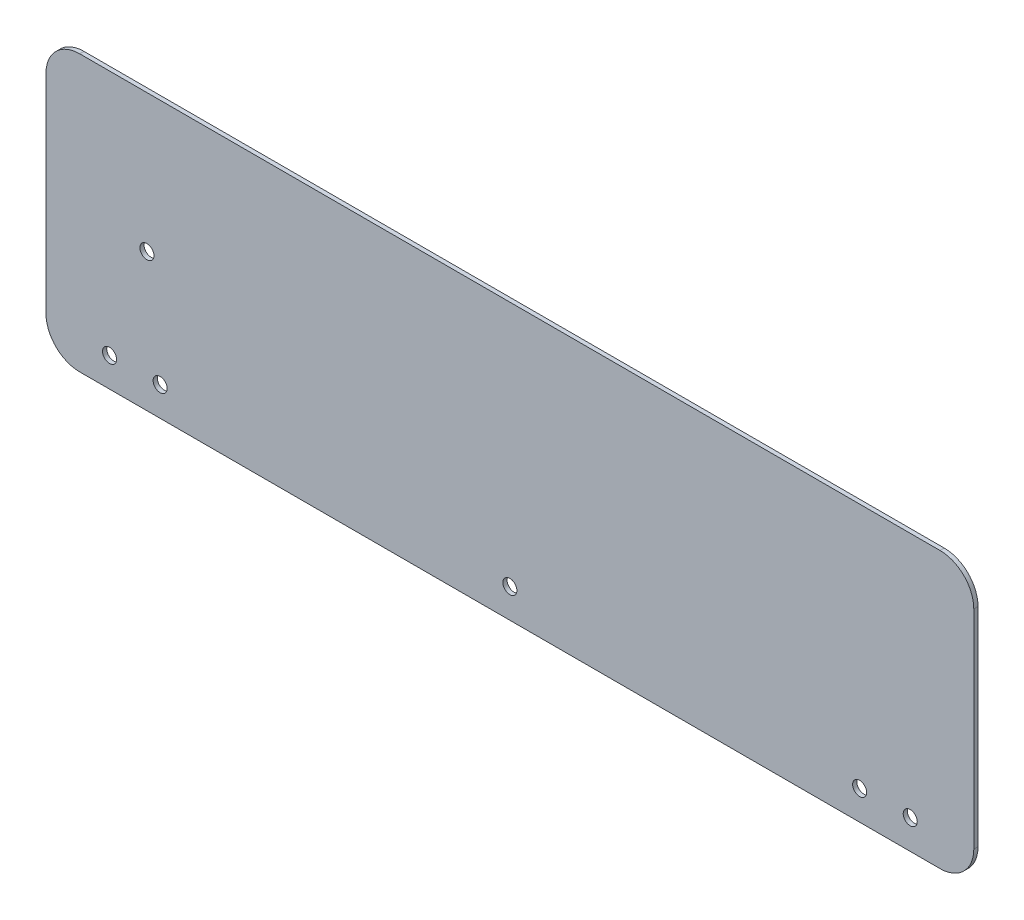
ISO-10303-21;
HEADER;
FILE_DESCRIPTION(('STEP AP214'),'2;1');
FILE_NAME('part.step','',(''),(''),'','','');
FILE_SCHEMA(('AUTOMOTIVE_DESIGN { 1 0 10303 214 1 1 1 1 }'));
ENDSEC;
DATA;
#1=APPLICATION_CONTEXT('core data for automotive mechanical design processes');
#2=APPLICATION_PROTOCOL_DEFINITION('international standard','automotive_design',2000,#1);
#3=PRODUCT_CONTEXT('',#1,'mechanical');
#4=PRODUCT('Part','Part','',(#3));
#5=PRODUCT_RELATED_PRODUCT_CATEGORY('part','',(#4));
#6=PRODUCT_DEFINITION_FORMATION('','',#4);
#7=PRODUCT_DEFINITION_CONTEXT('part definition',#1,'design');
#8=PRODUCT_DEFINITION('design','',#6,#7);
#9=PRODUCT_DEFINITION_SHAPE('','',#8);
#10=(LENGTH_UNIT() NAMED_UNIT(*) SI_UNIT(.MILLI.,.METRE.));
#11=(NAMED_UNIT(*) PLANE_ANGLE_UNIT() SI_UNIT($,.RADIAN.));
#12=(NAMED_UNIT(*) SI_UNIT($,.STERADIAN.) SOLID_ANGLE_UNIT());
#13=UNCERTAINTY_MEASURE_WITH_UNIT(LENGTH_MEASURE(1.E-05),#10,'distance_accuracy_value','');
#14=(GEOMETRIC_REPRESENTATION_CONTEXT(3) GLOBAL_UNCERTAINTY_ASSIGNED_CONTEXT((#13)) GLOBAL_UNIT_ASSIGNED_CONTEXT((#10,
#11,#12)) REPRESENTATION_CONTEXT('',''));
#15=CARTESIAN_POINT('',(0.,0.,0.));
#16=DIRECTION('',(0.,0.,1.));
#17=DIRECTION('',(1.,0.,0.));
#18=AXIS2_PLACEMENT_3D('',#15,#16,#17);
#19=CARTESIAN_POINT('',(19.431,4.699,-0.1905));
#20=DIRECTION('',(0.,0.,1.));
#21=DIRECTION('',(1.,0.,0.));
#22=AXIS2_PLACEMENT_3D('',#19,#20,#21);
#23=CYLINDRICAL_SURFACE('',#22,1.524);
#24=CARTESIAN_POINT('',(19.431,4.699,0.));
#25=DIRECTION('',(0.,0.,1.));
#26=DIRECTION('',(1.,0.,0.));
#27=AXIS2_PLACEMENT_3D('',#24,#25,#26);
#28=CIRCLE('',#27,1.524);
#29=CARTESIAN_POINT('',(20.955,4.699,0.));
#30=VERTEX_POINT('',#29);
#31=CARTESIAN_POINT('',(19.431,6.223,0.));
#32=VERTEX_POINT('',#31);
#33=EDGE_CURVE('E135',#30,#32,#28,.T.);
#34=ORIENTED_EDGE('',*,*,#33,.F.);
#35=DIRECTION('',(0.,0.,1.));
#36=VECTOR('',#35,1.);
#37=CARTESIAN_POINT('',(20.955,4.699,-0.1905));
#38=LINE('',#37,#36);
#39=CARTESIAN_POINT('',(20.955,4.699,-0.1905));
#40=VERTEX_POINT('',#39);
#41=EDGE_CURVE('E11',#40,#30,#38,.T.);
#42=ORIENTED_EDGE('',*,*,#41,.F.);
#43=CARTESIAN_POINT('',(19.431,4.699,-0.1905));
#44=DIRECTION('',(0.,0.,1.));
#45=DIRECTION('',(1.,0.,0.));
#46=AXIS2_PLACEMENT_3D('',#43,#44,#45);
#47=CIRCLE('',#46,1.524);
#48=CARTESIAN_POINT('',(19.431,6.223,-0.1905));
#49=VERTEX_POINT('',#48);
#50=EDGE_CURVE('E156',#40,#49,#47,.T.);
#51=ORIENTED_EDGE('',*,*,#50,.T.);
#52=DIRECTION('',(0.,0.,1.));
#53=VECTOR('',#52,1.);
#54=CARTESIAN_POINT('',(19.431,6.223,-0.1905));
#55=LINE('',#54,#53);
#56=EDGE_CURVE('E41',#49,#32,#55,.T.);
#57=ORIENTED_EDGE('',*,*,#56,.T.);
#58=EDGE_LOOP('',(#34,#42,#51,#57));
#59=FACE_BOUND('',#58,.T.);
#60=ADVANCED_FACE('F38',(#59),#23,.T.);
#61=CARTESIAN_POINT('',(20.955,-4.699,-0.1905));
#62=DIRECTION('',(1.,0.,0.));
#63=DIRECTION('',(0.,0.,-1.));
#64=AXIS2_PLACEMENT_3D('',#61,#62,#63);
#65=PLANE('',#64);
#66=DIRECTION('',(0.,1.,0.));
#67=VECTOR('',#66,1.);
#68=CARTESIAN_POINT('',(20.955,-4.699,0.));
#69=LINE('',#68,#67);
#70=CARTESIAN_POINT('',(20.955,-4.699,0.));
#71=VERTEX_POINT('',#70);
#72=EDGE_CURVE('E154',#71,#30,#69,.T.);
#73=ORIENTED_EDGE('',*,*,#72,.F.);
#74=DIRECTION('',(0.,0.,1.));
#75=VECTOR('',#74,1.);
#76=CARTESIAN_POINT('',(20.955,-4.699,-0.1905));
#77=LINE('',#76,#75);
#78=CARTESIAN_POINT('',(20.955,-4.699,-0.1905));
#79=VERTEX_POINT('',#78);
#80=EDGE_CURVE('E47',#79,#71,#77,.T.);
#81=ORIENTED_EDGE('',*,*,#80,.F.);
#82=DIRECTION('',(0.,1.,0.));
#83=VECTOR('',#82,1.);
#84=CARTESIAN_POINT('',(20.955,-4.699,-0.1905));
#85=LINE('',#84,#83);
#86=EDGE_CURVE('E125',#79,#40,#85,.T.);
#87=ORIENTED_EDGE('',*,*,#86,.T.);
#88=ORIENTED_EDGE('',*,*,#41,.T.);
#89=EDGE_LOOP('',(#73,#81,#87,#88));
#90=FACE_BOUND('',#89,.T.);
#91=ADVANCED_FACE('F168',(#90),#65,.T.);
#92=CARTESIAN_POINT('',(19.431,-4.699,-0.1905));
#93=DIRECTION('',(0.,0.,1.));
#94=DIRECTION('',(1.,0.,0.));
#95=AXIS2_PLACEMENT_3D('',#92,#93,#94);
#96=CYLINDRICAL_SURFACE('',#95,1.524);
#97=CARTESIAN_POINT('',(19.431,-4.699,0.));
#98=DIRECTION('',(0.,0.,1.));
#99=DIRECTION('',(1.,0.,0.));
#100=AXIS2_PLACEMENT_3D('',#97,#98,#99);
#101=CIRCLE('',#100,1.524);
#102=CARTESIAN_POINT('',(19.431,-6.223,0.));
#103=VERTEX_POINT('',#102);
#104=EDGE_CURVE('E112',#103,#71,#101,.T.);
#105=ORIENTED_EDGE('',*,*,#104,.F.);
#106=DIRECTION('',(0.,0.,1.));
#107=VECTOR('',#106,1.);
#108=CARTESIAN_POINT('',(19.431,-6.223,-0.1905));
#109=LINE('',#108,#107);
#110=CARTESIAN_POINT('',(19.431,-6.223,-0.1905));
#111=VERTEX_POINT('',#110);
#112=EDGE_CURVE('E107',#111,#103,#109,.T.);
#113=ORIENTED_EDGE('',*,*,#112,.F.);
#114=CARTESIAN_POINT('',(19.431,-4.699,-0.1905));
#115=DIRECTION('',(0.,0.,1.));
#116=DIRECTION('',(1.,0.,0.));
#117=AXIS2_PLACEMENT_3D('',#114,#115,#116);
#118=CIRCLE('',#117,1.524);
#119=EDGE_CURVE('E110',#111,#79,#118,.T.);
#120=ORIENTED_EDGE('',*,*,#119,.T.);
#121=ORIENTED_EDGE('',*,*,#80,.T.);
#122=EDGE_LOOP('',(#105,#113,#120,#121));
#123=FACE_BOUND('',#122,.T.);
#124=ADVANCED_FACE('F109',(#123),#96,.T.);
#125=CARTESIAN_POINT('',(-19.431,-6.223,-0.1905));
#126=DIRECTION('',(0.,-1.,0.));
#127=DIRECTION('',(0.,0.,-1.));
#128=AXIS2_PLACEMENT_3D('',#125,#126,#127);
#129=PLANE('',#128);
#130=DIRECTION('',(1.,0.,0.));
#131=VECTOR('',#130,1.);
#132=CARTESIAN_POINT('',(-19.431,-6.223,0.));
#133=LINE('',#132,#131);
#134=CARTESIAN_POINT('',(-19.431,-6.223,0.));
#135=VERTEX_POINT('',#134);
#136=EDGE_CURVE('E151',#135,#103,#133,.T.);
#137=ORIENTED_EDGE('',*,*,#136,.F.);
#138=DIRECTION('',(0.,0.,1.));
#139=VECTOR('',#138,1.);
#140=CARTESIAN_POINT('',(-19.431,-6.223,-0.1905));
#141=LINE('',#140,#139);
#142=CARTESIAN_POINT('',(-19.431,-6.223,-0.1905));
#143=VERTEX_POINT('',#142);
#144=EDGE_CURVE('E117',#143,#135,#141,.T.);
#145=ORIENTED_EDGE('',*,*,#144,.F.);
#146=DIRECTION('',(1.,0.,0.));
#147=VECTOR('',#146,1.);
#148=CARTESIAN_POINT('',(-19.431,-6.223,-0.1905));
#149=LINE('',#148,#147);
#150=EDGE_CURVE('E123',#143,#111,#149,.T.);
#151=ORIENTED_EDGE('',*,*,#150,.T.);
#152=ORIENTED_EDGE('',*,*,#112,.T.);
#153=EDGE_LOOP('',(#137,#145,#151,#152));
#154=FACE_BOUND('',#153,.T.);
#155=ADVANCED_FACE('F127',(#154),#129,.T.);
#156=CARTESIAN_POINT('',(-19.431,-4.699,-0.1905));
#157=DIRECTION('',(0.,0.,1.));
#158=DIRECTION('',(1.,0.,0.));
#159=AXIS2_PLACEMENT_3D('',#156,#157,#158);
#160=CYLINDRICAL_SURFACE('',#159,1.524);
#161=CARTESIAN_POINT('',(-19.431,-4.699,0.));
#162=DIRECTION('',(0.,0.,1.));
#163=DIRECTION('',(1.,0.,0.));
#164=AXIS2_PLACEMENT_3D('',#161,#162,#163);
#165=CIRCLE('',#164,1.524);
#166=CARTESIAN_POINT('',(-20.955,-4.699,0.));
#167=VERTEX_POINT('',#166);
#168=EDGE_CURVE('E148',#167,#135,#165,.T.);
#169=ORIENTED_EDGE('',*,*,#168,.F.);
#170=DIRECTION('',(0.,0.,1.));
#171=VECTOR('',#170,1.);
#172=CARTESIAN_POINT('',(-20.955,-4.699,-0.1905));
#173=LINE('',#172,#171);
#174=CARTESIAN_POINT('',(-20.955,-4.699,-0.1905));
#175=VERTEX_POINT('',#174);
#176=EDGE_CURVE('E160',#175,#167,#173,.T.);
#177=ORIENTED_EDGE('',*,*,#176,.F.);
#178=CARTESIAN_POINT('',(-19.431,-4.699,-0.1905));
#179=DIRECTION('',(0.,0.,1.));
#180=DIRECTION('',(1.,0.,0.));
#181=AXIS2_PLACEMENT_3D('',#178,#179,#180);
#182=CIRCLE('',#181,1.524);
#183=EDGE_CURVE('E128',#175,#143,#182,.T.);
#184=ORIENTED_EDGE('',*,*,#183,.T.);
#185=ORIENTED_EDGE('',*,*,#144,.T.);
#186=EDGE_LOOP('',(#169,#177,#184,#185));
#187=FACE_BOUND('',#186,.T.);
#188=ADVANCED_FACE('F181',(#187),#160,.T.);
#189=CARTESIAN_POINT('',(-20.955,4.699,-0.1905));
#190=DIRECTION('',(-1.,0.,0.));
#191=DIRECTION('',(0.,0.,1.));
#192=AXIS2_PLACEMENT_3D('',#189,#190,#191);
#193=PLANE('',#192);
#194=DIRECTION('',(0.,-1.,0.));
#195=VECTOR('',#194,1.);
#196=CARTESIAN_POINT('',(-20.955,4.699,0.));
#197=LINE('',#196,#195);
#198=CARTESIAN_POINT('',(-20.955,4.699,0.));
#199=VERTEX_POINT('',#198);
#200=EDGE_CURVE('E145',#199,#167,#197,.T.);
#201=ORIENTED_EDGE('',*,*,#200,.F.);
#202=DIRECTION('',(0.,0.,1.));
#203=VECTOR('',#202,1.);
#204=CARTESIAN_POINT('',(-20.955,4.699,-0.1905));
#205=LINE('',#204,#203);
#206=CARTESIAN_POINT('',(-20.955,4.699,-0.1905));
#207=VERTEX_POINT('',#206);
#208=EDGE_CURVE('E162',#207,#199,#205,.T.);
#209=ORIENTED_EDGE('',*,*,#208,.F.);
#210=DIRECTION('',(0.,-1.,0.));
#211=VECTOR('',#210,1.);
#212=CARTESIAN_POINT('',(-20.955,4.699,-0.1905));
#213=LINE('',#212,#211);
#214=EDGE_CURVE('E130',#207,#175,#213,.T.);
#215=ORIENTED_EDGE('',*,*,#214,.T.);
#216=ORIENTED_EDGE('',*,*,#176,.T.);
#217=EDGE_LOOP('',(#201,#209,#215,#216));
#218=FACE_BOUND('',#217,.T.);
#219=ADVANCED_FACE('F184',(#218),#193,.T.);
#220=CARTESIAN_POINT('',(-19.431,4.699,-0.1905));
#221=DIRECTION('',(0.,0.,1.));
#222=DIRECTION('',(1.,0.,0.));
#223=AXIS2_PLACEMENT_3D('',#220,#221,#222);
#224=CYLINDRICAL_SURFACE('',#223,1.524);
#225=CARTESIAN_POINT('',(-19.431,4.699,0.));
#226=DIRECTION('',(0.,0.,1.));
#227=DIRECTION('',(1.,0.,0.));
#228=AXIS2_PLACEMENT_3D('',#225,#226,#227);
#229=CIRCLE('',#228,1.524);
#230=CARTESIAN_POINT('',(-19.431,6.223,0.));
#231=VERTEX_POINT('',#230);
#232=EDGE_CURVE('E142',#231,#199,#229,.T.);
#233=ORIENTED_EDGE('',*,*,#232,.F.);
#234=DIRECTION('',(0.,0.,1.));
#235=VECTOR('',#234,1.);
#236=CARTESIAN_POINT('',(-19.431,6.223,-0.1905));
#237=LINE('',#236,#235);
#238=CARTESIAN_POINT('',(-19.431,6.223,-0.1905));
#239=VERTEX_POINT('',#238);
#240=EDGE_CURVE('E163',#239,#231,#237,.T.);
#241=ORIENTED_EDGE('',*,*,#240,.F.);
#242=CARTESIAN_POINT('',(-19.431,4.699,-0.1905));
#243=DIRECTION('',(0.,0.,1.));
#244=DIRECTION('',(1.,0.,0.));
#245=AXIS2_PLACEMENT_3D('',#242,#243,#244);
#246=CIRCLE('',#245,1.524);
#247=EDGE_CURVE('E270',#239,#207,#246,.T.);
#248=ORIENTED_EDGE('',*,*,#247,.T.);
#249=ORIENTED_EDGE('',*,*,#208,.T.);
#250=EDGE_LOOP('',(#233,#241,#248,#249));
#251=FACE_BOUND('',#250,.T.);
#252=ADVANCED_FACE('F188',(#251),#224,.T.);
#253=CARTESIAN_POINT('',(19.431,6.223,-0.1905));
#254=DIRECTION('',(0.,1.,0.));
#255=DIRECTION('',(0.,0.,1.));
#256=AXIS2_PLACEMENT_3D('',#253,#254,#255);
#257=PLANE('',#256);
#258=DIRECTION('',(-1.,0.,0.));
#259=VECTOR('',#258,1.);
#260=CARTESIAN_POINT('',(19.431,6.223,0.));
#261=LINE('',#260,#259);
#262=EDGE_CURVE('E138',#32,#231,#261,.T.);
#263=ORIENTED_EDGE('',*,*,#262,.F.);
#264=ORIENTED_EDGE('',*,*,#56,.F.);
#265=DIRECTION('',(-1.,0.,0.));
#266=VECTOR('',#265,1.);
#267=CARTESIAN_POINT('',(19.431,6.223,-0.1905));
#268=LINE('',#267,#266);
#269=EDGE_CURVE('E268',#49,#239,#268,.T.);
#270=ORIENTED_EDGE('',*,*,#269,.T.);
#271=ORIENTED_EDGE('',*,*,#240,.T.);
#272=EDGE_LOOP('',(#263,#264,#270,#271));
#273=FACE_BOUND('',#272,.T.);
#274=ADVANCED_FACE('F165',(#273),#257,.T.);
#275=CARTESIAN_POINT('',(19.431,4.699,-0.1905));
#276=DIRECTION('',(0.,0.,1.));
#277=DIRECTION('',(1.,0.,0.));
#278=AXIS2_PLACEMENT_3D('',#275,#276,#277);
#279=PLANE('',#278);
#280=CARTESIAN_POINT('',(-18.0848,-4.9022,-0.1905));
#281=DIRECTION('',(0.,0.,1.));
#282=DIRECTION('',(1.,0.,0.));
#283=AXIS2_PLACEMENT_3D('',#280,#281,#282);
#284=CIRCLE('',#283,0.3175);
#285=CARTESIAN_POINT('',(-17.7673,-4.9022,-0.1905));
#286=VERTEX_POINT('',#285);
#287=EDGE_CURVE('E231',#286,#286,#284,.T.);
#288=ORIENTED_EDGE('',*,*,#287,.T.);
#289=EDGE_LOOP('',(#288));
#290=FACE_BOUND('',#289,.T.);
#291=CARTESIAN_POINT('',(-15.7988,-4.9022,-0.1905));
#292=DIRECTION('',(0.,0.,1.));
#293=DIRECTION('',(1.,0.,0.));
#294=AXIS2_PLACEMENT_3D('',#291,#292,#293);
#295=CIRCLE('',#294,0.317500000000004);
#296=CARTESIAN_POINT('',(-15.4813,-4.9022,-0.1905));
#297=VERTEX_POINT('',#296);
#298=EDGE_CURVE('E239',#297,#297,#295,.T.);
#299=ORIENTED_EDGE('',*,*,#298,.T.);
#300=EDGE_LOOP('',(#299));
#301=FACE_BOUND('',#300,.T.);
#302=CARTESIAN_POINT('',(-16.3957,0.,-0.1905));
#303=DIRECTION('',(0.,0.,1.));
#304=DIRECTION('',(1.,0.,0.));
#305=AXIS2_PLACEMENT_3D('',#302,#303,#304);
#306=CIRCLE('',#305,0.317499999999997);
#307=CARTESIAN_POINT('',(-16.0782,0.,-0.1905));
#308=VERTEX_POINT('',#307);
#309=EDGE_CURVE('E245',#308,#308,#306,.T.);
#310=ORIENTED_EDGE('',*,*,#309,.T.);
#311=EDGE_LOOP('',(#310));
#312=FACE_BOUND('',#311,.T.);
#313=CARTESIAN_POINT('',(0.,-4.9022,-0.1905));
#314=DIRECTION('',(0.,0.,1.));
#315=DIRECTION('',(1.,0.,0.));
#316=AXIS2_PLACEMENT_3D('',#313,#314,#315);
#317=CIRCLE('',#316,0.317499999999999);
#318=CARTESIAN_POINT('',(0.317499999999999,-4.9022,-0.1905));
#319=VERTEX_POINT('',#318);
#320=EDGE_CURVE('E251',#319,#319,#317,.T.);
#321=ORIENTED_EDGE('',*,*,#320,.T.);
#322=EDGE_LOOP('',(#321));
#323=FACE_BOUND('',#322,.T.);
#324=CARTESIAN_POINT('',(15.7988,-4.90219999999999,-0.1905));
#325=DIRECTION('',(0.,0.,1.));
#326=DIRECTION('',(1.,0.,0.));
#327=AXIS2_PLACEMENT_3D('',#324,#325,#326);
#328=CIRCLE('',#327,0.317499999999996);
#329=CARTESIAN_POINT('',(16.1163,-4.90219999999999,-0.1905));
#330=VERTEX_POINT('',#329);
#331=EDGE_CURVE('E257',#330,#330,#328,.T.);
#332=ORIENTED_EDGE('',*,*,#331,.T.);
#333=EDGE_LOOP('',(#332));
#334=FACE_BOUND('',#333,.T.);
#335=CARTESIAN_POINT('',(18.0848,-4.9022,-0.1905));
#336=DIRECTION('',(0.,0.,1.));
#337=DIRECTION('',(1.,0.,0.));
#338=AXIS2_PLACEMENT_3D('',#335,#336,#337);
#339=CIRCLE('',#338,0.317499999999998);
#340=CARTESIAN_POINT('',(18.4023,-4.9022,-0.1905));
#341=VERTEX_POINT('',#340);
#342=EDGE_CURVE('E139',#341,#341,#339,.T.);
#343=ORIENTED_EDGE('',*,*,#342,.T.);
#344=EDGE_LOOP('',(#343));
#345=FACE_BOUND('',#344,.T.);
#346=ORIENTED_EDGE('',*,*,#50,.F.);
#347=ORIENTED_EDGE('',*,*,#86,.F.);
#348=ORIENTED_EDGE('',*,*,#119,.F.);
#349=ORIENTED_EDGE('',*,*,#150,.F.);
#350=ORIENTED_EDGE('',*,*,#183,.F.);
#351=ORIENTED_EDGE('',*,*,#214,.F.);
#352=ORIENTED_EDGE('',*,*,#247,.F.);
#353=ORIENTED_EDGE('',*,*,#269,.F.);
#354=EDGE_LOOP('',(#346,#347,#348,#349,#350,#351,#352,#353));
#355=FACE_BOUND('',#354,.T.);
#356=ADVANCED_FACE('F121',(#290,#301,#312,#323,#334,#345,#355),#279,.F.);
#357=CARTESIAN_POINT('',(19.431,4.699,0.));
#358=DIRECTION('',(0.,0.,1.));
#359=DIRECTION('',(1.,0.,0.));
#360=AXIS2_PLACEMENT_3D('',#357,#358,#359);
#361=PLANE('',#360);
#362=CARTESIAN_POINT('',(-18.0848,-4.9022,0.));
#363=DIRECTION('',(0.,0.,1.));
#364=DIRECTION('',(1.,0.,0.));
#365=AXIS2_PLACEMENT_3D('',#362,#363,#364);
#366=CIRCLE('',#365,0.3175);
#367=CARTESIAN_POINT('',(-17.7673,-4.9022,0.));
#368=VERTEX_POINT('',#367);
#369=EDGE_CURVE('E234',#368,#368,#366,.T.);
#370=ORIENTED_EDGE('',*,*,#369,.F.);
#371=EDGE_LOOP('',(#370));
#372=FACE_BOUND('',#371,.T.);
#373=CARTESIAN_POINT('',(-15.7988,-4.9022,0.));
#374=DIRECTION('',(0.,0.,1.));
#375=DIRECTION('',(1.,0.,0.));
#376=AXIS2_PLACEMENT_3D('',#373,#374,#375);
#377=CIRCLE('',#376,0.317500000000004);
#378=CARTESIAN_POINT('',(-15.4813,-4.9022,0.));
#379=VERTEX_POINT('',#378);
#380=EDGE_CURVE('E236',#379,#379,#377,.T.);
#381=ORIENTED_EDGE('',*,*,#380,.F.);
#382=EDGE_LOOP('',(#381));
#383=FACE_BOUND('',#382,.T.);
#384=CARTESIAN_POINT('',(-16.3957,0.,0.));
#385=DIRECTION('',(0.,0.,1.));
#386=DIRECTION('',(1.,0.,0.));
#387=AXIS2_PLACEMENT_3D('',#384,#385,#386);
#388=CIRCLE('',#387,0.317499999999997);
#389=CARTESIAN_POINT('',(-16.0782,0.,0.));
#390=VERTEX_POINT('',#389);
#391=EDGE_CURVE('E242',#390,#390,#388,.T.);
#392=ORIENTED_EDGE('',*,*,#391,.F.);
#393=EDGE_LOOP('',(#392));
#394=FACE_BOUND('',#393,.T.);
#395=CARTESIAN_POINT('',(0.,-4.9022,0.));
#396=DIRECTION('',(0.,0.,1.));
#397=DIRECTION('',(1.,0.,0.));
#398=AXIS2_PLACEMENT_3D('',#395,#396,#397);
#399=CIRCLE('',#398,0.317499999999999);
#400=CARTESIAN_POINT('',(0.317499999999999,-4.9022,0.));
#401=VERTEX_POINT('',#400);
#402=EDGE_CURVE('E248',#401,#401,#399,.T.);
#403=ORIENTED_EDGE('',*,*,#402,.F.);
#404=EDGE_LOOP('',(#403));
#405=FACE_BOUND('',#404,.T.);
#406=CARTESIAN_POINT('',(15.7988,-4.90219999999999,0.));
#407=DIRECTION('',(0.,0.,1.));
#408=DIRECTION('',(1.,0.,0.));
#409=AXIS2_PLACEMENT_3D('',#406,#407,#408);
#410=CIRCLE('',#409,0.317499999999996);
#411=CARTESIAN_POINT('',(16.1163,-4.90219999999999,0.));
#412=VERTEX_POINT('',#411);
#413=EDGE_CURVE('E254',#412,#412,#410,.T.);
#414=ORIENTED_EDGE('',*,*,#413,.F.);
#415=EDGE_LOOP('',(#414));
#416=FACE_BOUND('',#415,.T.);
#417=CARTESIAN_POINT('',(18.0848,-4.9022,0.));
#418=DIRECTION('',(0.,0.,1.));
#419=DIRECTION('',(1.,0.,0.));
#420=AXIS2_PLACEMENT_3D('',#417,#418,#419);
#421=CIRCLE('',#420,0.317499999999998);
#422=CARTESIAN_POINT('',(18.4023,-4.9022,0.));
#423=VERTEX_POINT('',#422);
#424=EDGE_CURVE('E260',#423,#423,#421,.T.);
#425=ORIENTED_EDGE('',*,*,#424,.F.);
#426=EDGE_LOOP('',(#425));
#427=FACE_BOUND('',#426,.T.);
#428=ORIENTED_EDGE('',*,*,#33,.T.);
#429=ORIENTED_EDGE('',*,*,#262,.T.);
#430=ORIENTED_EDGE('',*,*,#232,.T.);
#431=ORIENTED_EDGE('',*,*,#200,.T.);
#432=ORIENTED_EDGE('',*,*,#168,.T.);
#433=ORIENTED_EDGE('',*,*,#136,.T.);
#434=ORIENTED_EDGE('',*,*,#104,.T.);
#435=ORIENTED_EDGE('',*,*,#72,.T.);
#436=EDGE_LOOP('',(#428,#429,#430,#431,#432,#433,#434,#435));
#437=FACE_BOUND('',#436,.T.);
#438=ADVANCED_FACE('F167',(#372,#383,#394,#405,#416,#427,#437),#361,.T.);
#439=CARTESIAN_POINT('',(18.0848,-4.9022,-0.1905));
#440=DIRECTION('',(0.,0.,1.));
#441=DIRECTION('',(1.,0.,0.));
#442=AXIS2_PLACEMENT_3D('',#439,#440,#441);
#443=CYLINDRICAL_SURFACE('',#442,0.317499999999998);
#444=ORIENTED_EDGE('',*,*,#342,.F.);
#445=EDGE_LOOP('',(#444));
#446=FACE_BOUND('',#445,.T.);
#447=ORIENTED_EDGE('',*,*,#424,.T.);
#448=EDGE_LOOP('',(#447));
#449=FACE_BOUND('',#448,.T.);
#450=ADVANCED_FACE('F200',(#446,#449),#443,.F.);
#451=CARTESIAN_POINT('',(15.7988,-4.90219999999999,-0.1905));
#452=DIRECTION('',(0.,0.,1.));
#453=DIRECTION('',(1.,0.,0.));
#454=AXIS2_PLACEMENT_3D('',#451,#452,#453);
#455=CYLINDRICAL_SURFACE('',#454,0.317499999999996);
#456=ORIENTED_EDGE('',*,*,#331,.F.);
#457=EDGE_LOOP('',(#456));
#458=FACE_BOUND('',#457,.T.);
#459=ORIENTED_EDGE('',*,*,#413,.T.);
#460=EDGE_LOOP('',(#459));
#461=FACE_BOUND('',#460,.T.);
#462=ADVANCED_FACE('F207',(#458,#461),#455,.F.);
#463=CARTESIAN_POINT('',(0.,-4.9022,-0.1905));
#464=DIRECTION('',(0.,0.,1.));
#465=DIRECTION('',(1.,0.,0.));
#466=AXIS2_PLACEMENT_3D('',#463,#464,#465);
#467=CYLINDRICAL_SURFACE('',#466,0.317499999999999);
#468=ORIENTED_EDGE('',*,*,#320,.F.);
#469=EDGE_LOOP('',(#468));
#470=FACE_BOUND('',#469,.T.);
#471=ORIENTED_EDGE('',*,*,#402,.T.);
#472=EDGE_LOOP('',(#471));
#473=FACE_BOUND('',#472,.T.);
#474=ADVANCED_FACE('F211',(#470,#473),#467,.F.);
#475=CARTESIAN_POINT('',(-16.3957,0.,-0.1905));
#476=DIRECTION('',(0.,0.,1.));
#477=DIRECTION('',(1.,0.,0.));
#478=AXIS2_PLACEMENT_3D('',#475,#476,#477);
#479=CYLINDRICAL_SURFACE('',#478,0.317499999999997);
#480=ORIENTED_EDGE('',*,*,#309,.F.);
#481=EDGE_LOOP('',(#480));
#482=FACE_BOUND('',#481,.T.);
#483=ORIENTED_EDGE('',*,*,#391,.T.);
#484=EDGE_LOOP('',(#483));
#485=FACE_BOUND('',#484,.T.);
#486=ADVANCED_FACE('F215',(#482,#485),#479,.F.);
#487=CARTESIAN_POINT('',(-15.7988,-4.9022,-0.1905));
#488=DIRECTION('',(0.,0.,1.));
#489=DIRECTION('',(1.,0.,0.));
#490=AXIS2_PLACEMENT_3D('',#487,#488,#489);
#491=CYLINDRICAL_SURFACE('',#490,0.317500000000004);
#492=ORIENTED_EDGE('',*,*,#298,.F.);
#493=EDGE_LOOP('',(#492));
#494=FACE_BOUND('',#493,.T.);
#495=ORIENTED_EDGE('',*,*,#380,.T.);
#496=EDGE_LOOP('',(#495));
#497=FACE_BOUND('',#496,.T.);
#498=ADVANCED_FACE('F219',(#494,#497),#491,.F.);
#499=CARTESIAN_POINT('',(-18.0848,-4.9022,-0.1905));
#500=DIRECTION('',(0.,0.,1.));
#501=DIRECTION('',(1.,0.,0.));
#502=AXIS2_PLACEMENT_3D('',#499,#500,#501);
#503=CYLINDRICAL_SURFACE('',#502,0.3175);
#504=ORIENTED_EDGE('',*,*,#287,.F.);
#505=EDGE_LOOP('',(#504));
#506=FACE_BOUND('',#505,.T.);
#507=ORIENTED_EDGE('',*,*,#369,.T.);
#508=EDGE_LOOP('',(#507));
#509=FACE_BOUND('',#508,.T.);
#510=ADVANCED_FACE('F223',(#506,#509),#503,.F.);
#511=CLOSED_SHELL('',(#60,#91,#124,#155,#188,#219,#252,#274,#356,#438,#450,#462,#474,#486,#498,#510));
#512=MANIFOLD_SOLID_BREP('B2',#511);
#513=ADVANCED_BREP_SHAPE_REPRESENTATION('',(#18,#512),#14);
#514=SHAPE_DEFINITION_REPRESENTATION(#9,#513);
ENDSEC;
END-ISO-10303-21;
